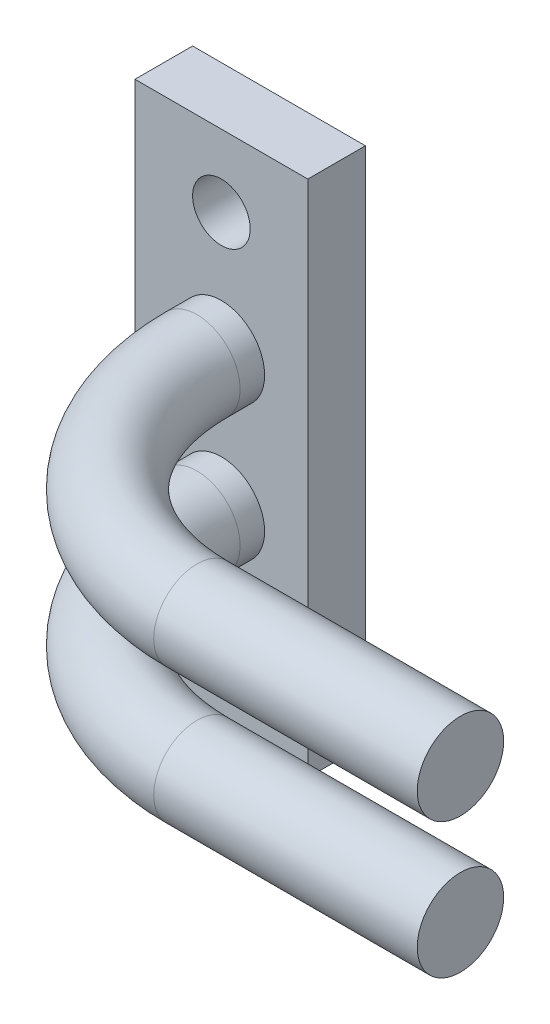
ISO-10303-21;
HEADER;
FILE_DESCRIPTION(('STEP AP214'),'2;1');
FILE_NAME('part.step','',(''),(''),'','','');
FILE_SCHEMA(('AUTOMOTIVE_DESIGN { 1 0 10303 214 1 1 1 1 }'));
ENDSEC;
DATA;
#1=APPLICATION_CONTEXT('core data for automotive mechanical design processes');
#2=APPLICATION_PROTOCOL_DEFINITION('international standard','automotive_design',2000,#1);
#3=PRODUCT_CONTEXT('',#1,'mechanical');
#4=PRODUCT('Part','Part','',(#3));
#5=PRODUCT_RELATED_PRODUCT_CATEGORY('part','',(#4));
#6=PRODUCT_DEFINITION_FORMATION('','',#4);
#7=PRODUCT_DEFINITION_CONTEXT('part definition',#1,'design');
#8=PRODUCT_DEFINITION('design','',#6,#7);
#9=PRODUCT_DEFINITION_SHAPE('','',#8);
#10=(LENGTH_UNIT() NAMED_UNIT(*) SI_UNIT(.MILLI.,.METRE.));
#11=(NAMED_UNIT(*) PLANE_ANGLE_UNIT() SI_UNIT($,.RADIAN.));
#12=(NAMED_UNIT(*) SI_UNIT($,.STERADIAN.) SOLID_ANGLE_UNIT());
#13=UNCERTAINTY_MEASURE_WITH_UNIT(LENGTH_MEASURE(1.E-05),#10,'distance_accuracy_value','');
#14=(GEOMETRIC_REPRESENTATION_CONTEXT(3) GLOBAL_UNCERTAINTY_ASSIGNED_CONTEXT((#13)) GLOBAL_UNIT_ASSIGNED_CONTEXT((#10,
#11,#12)) REPRESENTATION_CONTEXT('',''));
#15=CARTESIAN_POINT('',(0.,0.,0.));
#16=DIRECTION('',(0.,0.,1.));
#17=DIRECTION('',(1.,0.,0.));
#18=AXIS2_PLACEMENT_3D('',#15,#16,#17);
#19=CARTESIAN_POINT('',(3.,9.,2.));
#20=DIRECTION('',(0.,0.,-1.));
#21=DIRECTION('',(-1.,0.,0.));
#22=AXIS2_PLACEMENT_3D('',#19,#20,#21);
#23=PLANE('',#22);
#24=CARTESIAN_POINT('',(0.,-6.5,2.));
#25=DIRECTION('',(0.,0.,1.));
#26=DIRECTION('',(-1.,0.,0.));
#27=AXIS2_PLACEMENT_3D('',#24,#25,#26);
#28=CIRCLE('',#27,1.);
#29=CARTESIAN_POINT('',(-0.999999999999992,-6.5,2.));
#30=VERTEX_POINT('',#29);
#31=EDGE_CURVE('E130',#30,#30,#28,.T.);
#32=ORIENTED_EDGE('',*,*,#31,.F.);
#33=EDGE_LOOP('',(#32));
#34=FACE_BOUND('',#33,.T.);
#35=CARTESIAN_POINT('',(0.,6.5,2.));
#36=DIRECTION('',(0.,0.,1.));
#37=DIRECTION('',(1.,0.,0.));
#38=AXIS2_PLACEMENT_3D('',#35,#36,#37);
#39=CIRCLE('',#38,1.);
#40=CARTESIAN_POINT('',(1.,6.5,2.));
#41=VERTEX_POINT('',#40);
#42=EDGE_CURVE('E119',#41,#41,#39,.T.);
#43=ORIENTED_EDGE('',*,*,#42,.F.);
#44=EDGE_LOOP('',(#43));
#45=FACE_BOUND('',#44,.T.);
#46=CARTESIAN_POINT('',(0.,-2.35,2.));
#47=DIRECTION('',(0.,0.,1.));
#48=DIRECTION('',(1.,0.,0.));
#49=AXIS2_PLACEMENT_3D('',#46,#47,#48);
#50=CIRCLE('',#49,1.5);
#51=CARTESIAN_POINT('',(1.5,-2.35,2.));
#52=VERTEX_POINT('',#51);
#53=EDGE_CURVE('E41',#52,#52,#50,.T.);
#54=ORIENTED_EDGE('',*,*,#53,.F.);
#55=EDGE_LOOP('',(#54));
#56=FACE_BOUND('',#55,.T.);
#57=DIRECTION('',(0.,1.,0.));
#58=VECTOR('',#57,1.);
#59=CARTESIAN_POINT('',(3.,-9.,2.));
#60=LINE('',#59,#58);
#61=CARTESIAN_POINT('',(3.,-9.,2.));
#62=VERTEX_POINT('',#61);
#63=CARTESIAN_POINT('',(3.,9.,2.));
#64=VERTEX_POINT('',#63);
#65=EDGE_CURVE('E86',#62,#64,#60,.T.);
#66=ORIENTED_EDGE('',*,*,#65,.T.);
#67=DIRECTION('',(-1.,0.,0.));
#68=VECTOR('',#67,1.);
#69=CARTESIAN_POINT('',(-3.,9.,2.));
#70=LINE('',#69,#68);
#71=CARTESIAN_POINT('',(-3.,9.,2.));
#72=VERTEX_POINT('',#71);
#73=EDGE_CURVE('E81',#64,#72,#70,.T.);
#74=ORIENTED_EDGE('',*,*,#73,.T.);
#75=DIRECTION('',(0.,-1.,0.));
#76=VECTOR('',#75,1.);
#77=CARTESIAN_POINT('',(-3.,-9.,2.));
#78=LINE('',#77,#76);
#79=CARTESIAN_POINT('',(-3.,-9.,2.));
#80=VERTEX_POINT('',#79);
#81=EDGE_CURVE('E84',#72,#80,#78,.T.);
#82=ORIENTED_EDGE('',*,*,#81,.T.);
#83=DIRECTION('',(1.,0.,0.));
#84=VECTOR('',#83,1.);
#85=CARTESIAN_POINT('',(-3.,-9.,2.));
#86=LINE('',#85,#84);
#87=EDGE_CURVE('E50',#80,#62,#86,.T.);
#88=ORIENTED_EDGE('',*,*,#87,.T.);
#89=EDGE_LOOP('',(#66,#74,#82,#88));
#90=FACE_BOUND('',#89,.T.);
#91=CARTESIAN_POINT('',(0.,2.35,2.));
#92=DIRECTION('',(0.,0.,1.));
#93=DIRECTION('',(1.,0.,0.));
#94=AXIS2_PLACEMENT_3D('',#91,#92,#93);
#95=CIRCLE('',#94,1.5);
#96=CARTESIAN_POINT('',(1.5,2.35,2.));
#97=VERTEX_POINT('',#96);
#98=EDGE_CURVE('E11',#97,#97,#95,.T.);
#99=ORIENTED_EDGE('',*,*,#98,.F.);
#100=EDGE_LOOP('',(#99));
#101=FACE_BOUND('',#100,.T.);
#102=ADVANCED_FACE('F31',(#34,#45,#56,#90,#101),#23,.F.);
#103=CARTESIAN_POINT('',(3.,9.,0.));
#104=DIRECTION('',(0.,0.,-1.));
#105=DIRECTION('',(-1.,0.,0.));
#106=AXIS2_PLACEMENT_3D('',#103,#104,#105);
#107=PLANE('',#106);
#108=CARTESIAN_POINT('',(0.,-6.5,0.));
#109=DIRECTION('',(0.,0.,-1.));
#110=DIRECTION('',(-1.,0.,0.));
#111=AXIS2_PLACEMENT_3D('',#108,#109,#110);
#112=CIRCLE('',#111,1.);
#113=CARTESIAN_POINT('',(-0.999999999999992,-6.5,0.));
#114=VERTEX_POINT('',#113);
#115=EDGE_CURVE('E35',#114,#114,#112,.T.);
#116=ORIENTED_EDGE('',*,*,#115,.F.);
#117=EDGE_LOOP('',(#116));
#118=FACE_BOUND('',#117,.T.);
#119=CARTESIAN_POINT('',(0.,6.5,0.));
#120=DIRECTION('',(0.,0.,-1.));
#121=DIRECTION('',(-1.,0.,0.));
#122=AXIS2_PLACEMENT_3D('',#119,#120,#121);
#123=CIRCLE('',#122,1.);
#124=CARTESIAN_POINT('',(-1.,6.5,0.));
#125=VERTEX_POINT('',#124);
#126=EDGE_CURVE('E116',#125,#125,#123,.T.);
#127=ORIENTED_EDGE('',*,*,#126,.F.);
#128=EDGE_LOOP('',(#127));
#129=FACE_BOUND('',#128,.T.);
#130=CARTESIAN_POINT('',(0.,2.35,0.));
#131=DIRECTION('',(0.,0.,-1.));
#132=DIRECTION('',(-1.,0.,0.));
#133=AXIS2_PLACEMENT_3D('',#130,#131,#132);
#134=CIRCLE('',#133,1.5);
#135=CARTESIAN_POINT('',(-1.5,2.35,0.));
#136=VERTEX_POINT('',#135);
#137=EDGE_CURVE('E104',#136,#136,#134,.T.);
#138=ORIENTED_EDGE('',*,*,#137,.F.);
#139=EDGE_LOOP('',(#138));
#140=FACE_BOUND('',#139,.T.);
#141=DIRECTION('',(0.,1.,0.));
#142=VECTOR('',#141,1.);
#143=CARTESIAN_POINT('',(3.,-9.,0.));
#144=LINE('',#143,#142);
#145=CARTESIAN_POINT('',(3.,-9.,0.));
#146=VERTEX_POINT('',#145);
#147=CARTESIAN_POINT('',(3.,9.,0.));
#148=VERTEX_POINT('',#147);
#149=EDGE_CURVE('E101',#146,#148,#144,.T.);
#150=ORIENTED_EDGE('',*,*,#149,.F.);
#151=DIRECTION('',(1.,0.,0.));
#152=VECTOR('',#151,1.);
#153=CARTESIAN_POINT('',(-3.,-9.,0.));
#154=LINE('',#153,#152);
#155=CARTESIAN_POINT('',(-3.,-9.,0.));
#156=VERTEX_POINT('',#155);
#157=EDGE_CURVE('E73',#156,#146,#154,.T.);
#158=ORIENTED_EDGE('',*,*,#157,.F.);
#159=DIRECTION('',(0.,-1.,0.));
#160=VECTOR('',#159,1.);
#161=CARTESIAN_POINT('',(-3.,-9.,0.));
#162=LINE('',#161,#160);
#163=CARTESIAN_POINT('',(-3.,9.,0.));
#164=VERTEX_POINT('',#163);
#165=EDGE_CURVE('E67',#164,#156,#162,.T.);
#166=ORIENTED_EDGE('',*,*,#165,.F.);
#167=DIRECTION('',(-1.,0.,0.));
#168=VECTOR('',#167,1.);
#169=CARTESIAN_POINT('',(-3.,9.,0.));
#170=LINE('',#169,#168);
#171=EDGE_CURVE('E91',#148,#164,#170,.T.);
#172=ORIENTED_EDGE('',*,*,#171,.F.);
#173=EDGE_LOOP('',(#150,#158,#166,#172));
#174=FACE_BOUND('',#173,.T.);
#175=CARTESIAN_POINT('',(0.,-2.35,0.));
#176=DIRECTION('',(0.,0.,-1.));
#177=DIRECTION('',(-1.,0.,0.));
#178=AXIS2_PLACEMENT_3D('',#175,#176,#177);
#179=CIRCLE('',#178,1.5);
#180=CARTESIAN_POINT('',(-1.5,-2.35,0.));
#181=VERTEX_POINT('',#180);
#182=EDGE_CURVE('E149',#181,#181,#179,.T.);
#183=ORIENTED_EDGE('',*,*,#182,.F.);
#184=EDGE_LOOP('',(#183));
#185=FACE_BOUND('',#184,.T.);
#186=ADVANCED_FACE('F157',(#118,#129,#140,#174,#185),#107,.T.);
#187=CARTESIAN_POINT('',(3.,-9.,2.));
#188=DIRECTION('',(-1.,0.,0.));
#189=DIRECTION('',(0.,0.,1.));
#190=AXIS2_PLACEMENT_3D('',#187,#188,#189);
#191=PLANE('',#190);
#192=ORIENTED_EDGE('',*,*,#149,.T.);
#193=DIRECTION('',(0.,0.,-1.));
#194=VECTOR('',#193,1.);
#195=CARTESIAN_POINT('',(3.,9.,2.));
#196=LINE('',#195,#194);
#197=EDGE_CURVE('E92',#64,#148,#196,.T.);
#198=ORIENTED_EDGE('',*,*,#197,.F.);
#199=ORIENTED_EDGE('',*,*,#65,.F.);
#200=DIRECTION('',(0.,0.,-1.));
#201=VECTOR('',#200,1.);
#202=CARTESIAN_POINT('',(3.,-9.,2.));
#203=LINE('',#202,#201);
#204=EDGE_CURVE('E97',#62,#146,#203,.T.);
#205=ORIENTED_EDGE('',*,*,#204,.T.);
#206=EDGE_LOOP('',(#192,#198,#199,#205));
#207=FACE_BOUND('',#206,.T.);
#208=ADVANCED_FACE('F160',(#207),#191,.F.);
#209=CARTESIAN_POINT('',(-3.,9.,2.));
#210=DIRECTION('',(0.,-1.,0.));
#211=DIRECTION('',(0.,0.,-1.));
#212=AXIS2_PLACEMENT_3D('',#209,#210,#211);
#213=PLANE('',#212);
#214=ORIENTED_EDGE('',*,*,#171,.T.);
#215=DIRECTION('',(0.,0.,-1.));
#216=VECTOR('',#215,1.);
#217=CARTESIAN_POINT('',(-3.,9.,2.));
#218=LINE('',#217,#216);
#219=EDGE_CURVE('E89',#72,#164,#218,.T.);
#220=ORIENTED_EDGE('',*,*,#219,.F.);
#221=ORIENTED_EDGE('',*,*,#73,.F.);
#222=ORIENTED_EDGE('',*,*,#197,.T.);
#223=EDGE_LOOP('',(#214,#220,#221,#222));
#224=FACE_BOUND('',#223,.T.);
#225=ADVANCED_FACE('F90',(#224),#213,.F.);
#226=CARTESIAN_POINT('',(-3.,-9.,2.));
#227=DIRECTION('',(1.,0.,0.));
#228=DIRECTION('',(0.,0.,-1.));
#229=AXIS2_PLACEMENT_3D('',#226,#227,#228);
#230=PLANE('',#229);
#231=ORIENTED_EDGE('',*,*,#165,.T.);
#232=DIRECTION('',(0.,0.,-1.));
#233=VECTOR('',#232,1.);
#234=CARTESIAN_POINT('',(-3.,-9.,2.));
#235=LINE('',#234,#233);
#236=EDGE_CURVE('E93',#80,#156,#235,.T.);
#237=ORIENTED_EDGE('',*,*,#236,.F.);
#238=ORIENTED_EDGE('',*,*,#81,.F.);
#239=ORIENTED_EDGE('',*,*,#219,.T.);
#240=EDGE_LOOP('',(#231,#237,#238,#239));
#241=FACE_BOUND('',#240,.T.);
#242=ADVANCED_FACE('F95',(#241),#230,.F.);
#243=CARTESIAN_POINT('',(-3.,-9.,2.));
#244=DIRECTION('',(0.,1.,0.));
#245=DIRECTION('',(0.,0.,1.));
#246=AXIS2_PLACEMENT_3D('',#243,#244,#245);
#247=PLANE('',#246);
#248=ORIENTED_EDGE('',*,*,#157,.T.);
#249=ORIENTED_EDGE('',*,*,#204,.F.);
#250=ORIENTED_EDGE('',*,*,#87,.F.);
#251=ORIENTED_EDGE('',*,*,#236,.T.);
#252=EDGE_LOOP('',(#248,#249,#250,#251));
#253=FACE_BOUND('',#252,.T.);
#254=ADVANCED_FACE('F177',(#253),#247,.F.);
#255=CARTESIAN_POINT('',(0.,2.35,-2.1));
#256=DIRECTION('',(0.,0.,1.));
#257=DIRECTION('',(1.,0.,0.));
#258=AXIS2_PLACEMENT_3D('',#255,#256,#257);
#259=CYLINDRICAL_SURFACE('',#258,1.5);
#260=CARTESIAN_POINT('',(0.,2.35,-0.6));
#261=DIRECTION('',(0.,0.,1.));
#262=DIRECTION('',(1.,0.,0.));
#263=AXIS2_PLACEMENT_3D('',#260,#261,#262);
#264=CIRCLE('',#263,1.5);
#265=CARTESIAN_POINT('',(1.5,2.35,-0.6));
#266=VERTEX_POINT('',#265);
#267=EDGE_CURVE('E114',#266,#266,#264,.T.);
#268=ORIENTED_EDGE('',*,*,#267,.T.);
#269=EDGE_LOOP('',(#268));
#270=FACE_BOUND('',#269,.T.);
#271=ORIENTED_EDGE('',*,*,#137,.T.);
#272=EDGE_LOOP('',(#271));
#273=FACE_BOUND('',#272,.T.);
#274=ADVANCED_FACE('F155',(#270,#273),#259,.T.);
#275=CARTESIAN_POINT('',(0.,-2.35,-2.1));
#276=DIRECTION('',(0.,0.,1.));
#277=DIRECTION('',(1.,0.,0.));
#278=AXIS2_PLACEMENT_3D('',#275,#276,#277);
#279=CYLINDRICAL_SURFACE('',#278,1.5);
#280=CARTESIAN_POINT('',(0.,-2.35,-0.6));
#281=DIRECTION('',(0.,0.,1.));
#282=DIRECTION('',(1.,0.,0.));
#283=AXIS2_PLACEMENT_3D('',#280,#281,#282);
#284=CIRCLE('',#283,1.5);
#285=CARTESIAN_POINT('',(1.5,-2.35,-0.6));
#286=VERTEX_POINT('',#285);
#287=EDGE_CURVE('E111',#286,#286,#284,.T.);
#288=ORIENTED_EDGE('',*,*,#287,.T.);
#289=EDGE_LOOP('',(#288));
#290=FACE_BOUND('',#289,.T.);
#291=ORIENTED_EDGE('',*,*,#182,.T.);
#292=EDGE_LOOP('',(#291));
#293=FACE_BOUND('',#292,.T.);
#294=ADVANCED_FACE('F167',(#290,#293),#279,.T.);
#295=CARTESIAN_POINT('',(0.,-2.35,-0.6));
#296=DIRECTION('',(0.,0.,1.));
#297=DIRECTION('',(1.,0.,0.));
#298=AXIS2_PLACEMENT_3D('',#295,#296,#297);
#299=SPHERICAL_SURFACE('',#298,1.5);
#300=ORIENTED_EDGE('',*,*,#287,.F.);
#301=EDGE_LOOP('',(#300));
#302=FACE_BOUND('',#301,.T.);
#303=ADVANCED_FACE('F169',(#302),#299,.T.);
#304=CARTESIAN_POINT('',(0.,2.35,-0.6));
#305=DIRECTION('',(0.,0.,1.));
#306=DIRECTION('',(1.,0.,0.));
#307=AXIS2_PLACEMENT_3D('',#304,#305,#306);
#308=SPHERICAL_SURFACE('',#307,1.5);
#309=ORIENTED_EDGE('',*,*,#267,.F.);
#310=EDGE_LOOP('',(#309));
#311=FACE_BOUND('',#310,.T.);
#312=ADVANCED_FACE('F33',(#311),#308,.T.);
#313=CARTESIAN_POINT('',(7.5,-2.35,10.35));
#314=DIRECTION('',(1.,0.,0.));
#315=DIRECTION('',(0.,0.,-1.));
#316=AXIS2_PLACEMENT_3D('',#313,#314,#315);
#317=CYLINDRICAL_SURFACE('',#316,1.5);
#318=CARTESIAN_POINT('',(7.5,-2.35,10.35));
#319=DIRECTION('',(1.,0.,0.));
#320=DIRECTION('',(0.,0.,-1.));
#321=AXIS2_PLACEMENT_3D('',#318,#319,#320);
#322=CIRCLE('',#321,1.5);
#323=CARTESIAN_POINT('',(7.5,-2.35,11.85));
#324=VERTEX_POINT('',#323);
#325=EDGE_CURVE('E141',#324,#324,#322,.T.);
#326=ORIENTED_EDGE('',*,*,#325,.T.);
#327=EDGE_LOOP('',(#326));
#328=FACE_BOUND('',#327,.T.);
#329=CARTESIAN_POINT('',(16.65,-2.35,10.35));
#330=DIRECTION('',(1.,0.,0.));
#331=DIRECTION('',(0.,0.,-1.));
#332=AXIS2_PLACEMENT_3D('',#329,#330,#331);
#333=CIRCLE('',#332,1.5);
#334=CARTESIAN_POINT('',(16.65,-2.35,8.85));
#335=VERTEX_POINT('',#334);
#336=EDGE_CURVE('E146',#335,#335,#333,.T.);
#337=ORIENTED_EDGE('',*,*,#336,.F.);
#338=EDGE_LOOP('',(#337));
#339=FACE_BOUND('',#338,.T.);
#340=ADVANCED_FACE('F237',(#328,#339),#317,.T.);
#341=CARTESIAN_POINT('',(7.5,-2.35,2.85));
#342=DIRECTION('',(0.,1.,0.));
#343=DIRECTION('',(0.,0.,1.));
#344=AXIS2_PLACEMENT_3D('',#341,#342,#343);
#345=TOROIDAL_SURFACE('',#344,7.5,1.5);
#346=CARTESIAN_POINT('',(0.,-2.35,2.85));
#347=DIRECTION('',(0.,0.,1.));
#348=DIRECTION('',(1.,0.,0.));
#349=AXIS2_PLACEMENT_3D('',#346,#347,#348);
#350=CIRCLE('',#349,1.5);
#351=CARTESIAN_POINT('',(-1.5,-2.35,2.85));
#352=VERTEX_POINT('',#351);
#353=EDGE_CURVE('E138',#352,#352,#350,.T.);
#354=CARTESIAN_POINT('',(7.5,-2.35,2.85));
#355=DIRECTION('',(0.,1.,0.));
#356=DIRECTION('',(0.,0.,1.));
#357=AXIS2_PLACEMENT_3D('',#354,#355,#356);
#358=CIRCLE('',#357,9.);
#359=EDGE_CURVE('',#352,#324,#358,.T.);
#360=ORIENTED_EDGE('',*,*,#353,.T.);
#361=ORIENTED_EDGE('',*,*,#325,.F.);
#362=ORIENTED_EDGE('',*,*,#359,.T.);
#363=ORIENTED_EDGE('',*,*,#359,.F.);
#364=EDGE_LOOP('',(#360,#362,#361,#363));
#365=FACE_BOUND('',#364,.T.);
#366=ADVANCED_FACE('F247',(#365),#345,.T.);
#367=CARTESIAN_POINT('',(0.,-2.35,2.85));
#368=DIRECTION('',(0.,0.,-1.));
#369=DIRECTION('',(-1.,0.,0.));
#370=AXIS2_PLACEMENT_3D('',#367,#368,#369);
#371=CYLINDRICAL_SURFACE('',#370,1.5);
#372=ORIENTED_EDGE('',*,*,#353,.F.);
#373=EDGE_LOOP('',(#372));
#374=FACE_BOUND('',#373,.T.);
#375=ORIENTED_EDGE('',*,*,#53,.T.);
#376=EDGE_LOOP('',(#375));
#377=FACE_BOUND('',#376,.T.);
#378=ADVANCED_FACE('F256',(#374,#377),#371,.T.);
#379=CARTESIAN_POINT('',(16.65,-2.35,10.35));
#380=DIRECTION('',(1.,0.,0.));
#381=DIRECTION('',(0.,0.,-1.));
#382=AXIS2_PLACEMENT_3D('',#379,#380,#381);
#383=PLANE('',#382);
#384=ORIENTED_EDGE('',*,*,#336,.T.);
#385=EDGE_LOOP('',(#384));
#386=FACE_BOUND('',#385,.T.);
#387=ADVANCED_FACE('F266',(#386),#383,.T.);
#388=CARTESIAN_POINT('',(7.5,2.35,10.35));
#389=DIRECTION('',(1.,0.,0.));
#390=DIRECTION('',(0.,0.,-1.));
#391=AXIS2_PLACEMENT_3D('',#388,#389,#390);
#392=CYLINDRICAL_SURFACE('',#391,1.5);
#393=CARTESIAN_POINT('',(7.5,2.35,10.35));
#394=DIRECTION('',(1.,0.,0.));
#395=DIRECTION('',(0.,0.,-1.));
#396=AXIS2_PLACEMENT_3D('',#393,#394,#395);
#397=CIRCLE('',#396,1.5);
#398=CARTESIAN_POINT('',(7.5,2.35,11.85));
#399=VERTEX_POINT('',#398);
#400=EDGE_CURVE('E123',#399,#399,#397,.T.);
#401=ORIENTED_EDGE('',*,*,#400,.T.);
#402=EDGE_LOOP('',(#401));
#403=FACE_BOUND('',#402,.T.);
#404=CARTESIAN_POINT('',(16.65,2.35,10.35));
#405=DIRECTION('',(1.,0.,0.));
#406=DIRECTION('',(0.,0.,-1.));
#407=AXIS2_PLACEMENT_3D('',#404,#405,#406);
#408=CIRCLE('',#407,1.5);
#409=CARTESIAN_POINT('',(16.65,2.35,8.85));
#410=VERTEX_POINT('',#409);
#411=EDGE_CURVE('E135',#410,#410,#408,.T.);
#412=ORIENTED_EDGE('',*,*,#411,.F.);
#413=EDGE_LOOP('',(#412));
#414=FACE_BOUND('',#413,.T.);
#415=ADVANCED_FACE('F276',(#403,#414),#392,.T.);
#416=CARTESIAN_POINT('',(7.5,2.35,2.85));
#417=DIRECTION('',(0.,1.,0.));
#418=DIRECTION('',(0.,0.,1.));
#419=AXIS2_PLACEMENT_3D('',#416,#417,#418);
#420=TOROIDAL_SURFACE('',#419,7.5,1.5);
#421=CARTESIAN_POINT('',(0.,2.35,2.85));
#422=DIRECTION('',(0.,0.,1.));
#423=DIRECTION('',(1.,0.,0.));
#424=AXIS2_PLACEMENT_3D('',#421,#422,#423);
#425=CIRCLE('',#424,1.5);
#426=CARTESIAN_POINT('',(-1.5,2.35,2.85));
#427=VERTEX_POINT('',#426);
#428=EDGE_CURVE('E118',#427,#427,#425,.T.);
#429=CARTESIAN_POINT('',(7.5,2.35,2.85));
#430=DIRECTION('',(0.,1.,0.));
#431=DIRECTION('',(0.,0.,1.));
#432=AXIS2_PLACEMENT_3D('',#429,#430,#431);
#433=CIRCLE('',#432,9.);
#434=EDGE_CURVE('',#427,#399,#433,.T.);
#435=ORIENTED_EDGE('',*,*,#428,.T.);
#436=ORIENTED_EDGE('',*,*,#400,.F.);
#437=ORIENTED_EDGE('',*,*,#434,.T.);
#438=ORIENTED_EDGE('',*,*,#434,.F.);
#439=EDGE_LOOP('',(#435,#437,#436,#438));
#440=FACE_BOUND('',#439,.T.);
#441=ADVANCED_FACE('F286',(#440),#420,.T.);
#442=CARTESIAN_POINT('',(0.,2.35,2.85));
#443=DIRECTION('',(0.,0.,-1.));
#444=DIRECTION('',(-1.,0.,0.));
#445=AXIS2_PLACEMENT_3D('',#442,#443,#444);
#446=CYLINDRICAL_SURFACE('',#445,1.5);
#447=ORIENTED_EDGE('',*,*,#428,.F.);
#448=EDGE_LOOP('',(#447));
#449=FACE_BOUND('',#448,.T.);
#450=ORIENTED_EDGE('',*,*,#98,.T.);
#451=EDGE_LOOP('',(#450));
#452=FACE_BOUND('',#451,.T.);
#453=ADVANCED_FACE('F296',(#449,#452),#446,.T.);
#454=CARTESIAN_POINT('',(16.65,2.35,10.35));
#455=DIRECTION('',(1.,0.,0.));
#456=DIRECTION('',(0.,0.,-1.));
#457=AXIS2_PLACEMENT_3D('',#454,#455,#456);
#458=PLANE('',#457);
#459=ORIENTED_EDGE('',*,*,#411,.T.);
#460=EDGE_LOOP('',(#459));
#461=FACE_BOUND('',#460,.T.);
#462=ADVANCED_FACE('F306',(#461),#458,.T.);
#463=CARTESIAN_POINT('',(0.,6.5,-2.1));
#464=DIRECTION('',(0.,0.,1.));
#465=DIRECTION('',(1.,0.,0.));
#466=AXIS2_PLACEMENT_3D('',#463,#464,#465);
#467=CYLINDRICAL_SURFACE('',#466,1.);
#468=ORIENTED_EDGE('',*,*,#126,.T.);
#469=EDGE_LOOP('',(#468));
#470=FACE_BOUND('',#469,.T.);
#471=ORIENTED_EDGE('',*,*,#42,.T.);
#472=EDGE_LOOP('',(#471));
#473=FACE_BOUND('',#472,.T.);
#474=ADVANCED_FACE('F315',(#470,#473),#467,.F.);
#475=CARTESIAN_POINT('',(0.,-6.5,-2.1));
#476=DIRECTION('',(0.,0.,1.));
#477=DIRECTION('',(1.,0.,0.));
#478=AXIS2_PLACEMENT_3D('',#475,#476,#477);
#479=CYLINDRICAL_SURFACE('',#478,1.);
#480=ORIENTED_EDGE('',*,*,#115,.T.);
#481=EDGE_LOOP('',(#480));
#482=FACE_BOUND('',#481,.T.);
#483=ORIENTED_EDGE('',*,*,#31,.T.);
#484=EDGE_LOOP('',(#483));
#485=FACE_BOUND('',#484,.T.);
#486=ADVANCED_FACE('F332',(#482,#485),#479,.F.);
#487=CLOSED_SHELL('',(#102,#186,#208,#225,#242,#254,#274,#294,#303,#312,#340,#366,#378,#387,
#415,#441,#453,#462,#474,#486));
#488=MANIFOLD_SOLID_BREP('B2',#487);
#489=ADVANCED_BREP_SHAPE_REPRESENTATION('',(#18,#488),#14);
#490=SHAPE_DEFINITION_REPRESENTATION(#9,#489);
ENDSEC;
END-ISO-10303-21;
